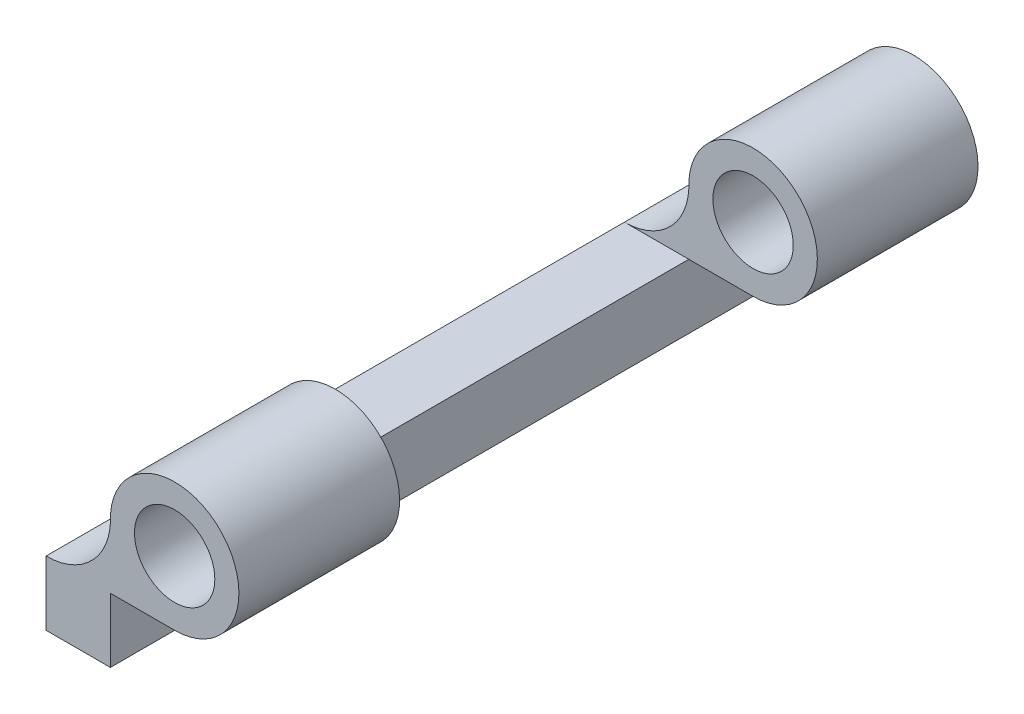
ISO-10303-21;
HEADER;
FILE_DESCRIPTION(('STEP AP214'),'2;1');
FILE_NAME('part.step','',(''),(''),'','','');
FILE_SCHEMA(('AUTOMOTIVE_DESIGN { 1 0 10303 214 1 1 1 1 }'));
ENDSEC;
DATA;
#1=APPLICATION_CONTEXT('core data for automotive mechanical design processes');
#2=APPLICATION_PROTOCOL_DEFINITION('international standard','automotive_design',2000,#1);
#3=PRODUCT_CONTEXT('',#1,'mechanical');
#4=PRODUCT('Part','Part','',(#3));
#5=PRODUCT_RELATED_PRODUCT_CATEGORY('part','',(#4));
#6=PRODUCT_DEFINITION_FORMATION('','',#4);
#7=PRODUCT_DEFINITION_CONTEXT('part definition',#1,'design');
#8=PRODUCT_DEFINITION('design','',#6,#7);
#9=PRODUCT_DEFINITION_SHAPE('','',#8);
#10=(LENGTH_UNIT() NAMED_UNIT(*) SI_UNIT(.MILLI.,.METRE.));
#11=(NAMED_UNIT(*) PLANE_ANGLE_UNIT() SI_UNIT($,.RADIAN.));
#12=(NAMED_UNIT(*) SI_UNIT($,.STERADIAN.) SOLID_ANGLE_UNIT());
#13=UNCERTAINTY_MEASURE_WITH_UNIT(LENGTH_MEASURE(1.E-05),#10,'distance_accuracy_value','');
#14=(GEOMETRIC_REPRESENTATION_CONTEXT(3) GLOBAL_UNCERTAINTY_ASSIGNED_CONTEXT((#13)) GLOBAL_UNIT_ASSIGNED_CONTEXT((#10,
#11,#12)) REPRESENTATION_CONTEXT('',''));
#15=CARTESIAN_POINT('',(0.,0.,0.));
#16=DIRECTION('',(0.,0.,1.));
#17=DIRECTION('',(1.,0.,0.));
#18=AXIS2_PLACEMENT_3D('',#15,#16,#17);
#19=CARTESIAN_POINT('',(3.33301378208247,-2.,6.4428661419352));
#20=DIRECTION('',(0.,0.,1.));
#21=DIRECTION('',(1.,0.,0.));
#22=AXIS2_PLACEMENT_3D('',#19,#20,#21);
#23=PLANE('',#22);
#24=CARTESIAN_POINT('',(7.33677889014635,4.,6.4428661419352));
#25=DIRECTION('',(0.,0.,1.));
#26=DIRECTION('',(1.,0.,0.));
#27=AXIS2_PLACEMENT_3D('',#24,#25,#26);
#28=CIRCLE('',#27,1.25);
#29=CARTESIAN_POINT('',(8.58677889014635,4.,6.4428661419352));
#30=VERTEX_POINT('',#29);
#31=EDGE_CURVE('E267',#30,#30,#28,.T.);
#32=ORIENTED_EDGE('',*,*,#31,.T.);
#33=EDGE_LOOP('',(#32));
#34=FACE_BOUND('',#33,.T.);
#35=DIRECTION('',(1.,0.,0.));
#36=VECTOR('',#35,1.);
#37=CARTESIAN_POINT('',(3.33301378208247,2.,6.4428661419352));
#38=LINE('',#37,#36);
#39=CARTESIAN_POINT('',(3.33489114739808,2.,6.4428661419352));
#40=VERTEX_POINT('',#39);
#41=CARTESIAN_POINT('',(5.33755556210372,2.,6.4428661419352));
#42=VERTEX_POINT('',#41);
#43=EDGE_CURVE('E207',#40,#42,#38,.T.);
#44=ORIENTED_EDGE('',*,*,#43,.F.);
#45=CARTESIAN_POINT('',(3.33676851271369,4.0037242538775,6.44286614193519));
#46=DIRECTION('',(0.,0.,1.));
#47=DIRECTION('',(1.,0.,0.));
#48=AXIS2_PLACEMENT_3D('',#45,#46,#47);
#49=CIRCLE('',#48,2.00372777182407);
#50=CARTESIAN_POINT('',(5.3385590370091,3.91563520563563,6.4428661419352));
#51=VERTEX_POINT('',#50);
#52=EDGE_CURVE('E260',#40,#51,#49,.T.);
#53=ORIENTED_EDGE('',*,*,#52,.T.);
#54=CARTESIAN_POINT('',(7.33677889014635,4.,6.4428661419352));
#55=DIRECTION('',(0.,0.,1.));
#56=DIRECTION('',(1.,0.,0.));
#57=AXIS2_PLACEMENT_3D('',#54,#55,#56);
#58=CIRCLE('',#57,2.);
#59=CARTESIAN_POINT('',(7.33677889014635,2.,6.4428661419352));
#60=VERTEX_POINT('',#59);
#61=EDGE_CURVE('E263',#60,#51,#58,.T.);
#62=ORIENTED_EDGE('',*,*,#61,.F.);
#63=DIRECTION('',(-1.,0.,0.));
#64=VECTOR('',#63,1.);
#65=CARTESIAN_POINT('',(3.33301378208247,2.,6.4428661419352));
#66=LINE('',#65,#64);
#67=EDGE_CURVE('E225',#60,#42,#66,.T.);
#68=ORIENTED_EDGE('',*,*,#67,.T.);
#69=EDGE_LOOP('',(#44,#53,#62,#68));
#70=FACE_BOUND('',#69,.T.);
#71=ADVANCED_FACE('F43',(#34,#70),#23,.F.);
#72=CARTESIAN_POINT('',(7.33716722612504,0.000388335978676775,3.61526276220608));
#73=DIRECTION('',(0.,0.,1.));
#74=DIRECTION('',(1.,0.,0.));
#75=AXIS2_PLACEMENT_3D('',#72,#73,#74);
#76=CYLINDRICAL_SURFACE('',#75,1.99961170172985);
#77=CARTESIAN_POINT('',(7.33716722612504,0.000388335978676775,6.4428661419352));
#78=DIRECTION('',(0.,0.,1.));
#79=DIRECTION('',(1.,0.,0.));
#80=AXIS2_PLACEMENT_3D('',#77,#78,#79);
#81=CIRCLE('',#80,1.99961170172985);
#82=CARTESIAN_POINT('',(5.33755554324946,0.000388335978676775,6.4428661419352));
#83=VERTEX_POINT('',#82);
#84=CARTESIAN_POINT('',(5.33755556210372,0.,6.4428661419352));
#85=VERTEX_POINT('',#84);
#86=EDGE_CURVE('E245',#83,#85,#81,.T.);
#87=ORIENTED_EDGE('',*,*,#86,.F.);
#88=DIRECTION('',(0.,0.,1.));
#89=VECTOR('',#88,1.);
#90=CARTESIAN_POINT('',(5.33755554324946,0.000388335978676775,3.61526276220608));
#91=LINE('',#90,#89);
#92=CARTESIAN_POINT('',(5.33755556210372,0.000388335978675908,11.4428661419352));
#93=VERTEX_POINT('',#92);
#94=EDGE_CURVE('E222',#83,#93,#91,.T.);
#95=ORIENTED_EDGE('',*,*,#94,.T.);
#96=CARTESIAN_POINT('',(7.33716722612504,0.000388335978676775,11.4428661419352));
#97=DIRECTION('',(0.,0.,-1.));
#98=DIRECTION('',(-1.,0.,0.));
#99=AXIS2_PLACEMENT_3D('',#96,#97,#98);
#100=CIRCLE('',#99,1.99961170172985);
#101=CARTESIAN_POINT('',(5.33755556210372,0.,11.4428661419352));
#102=VERTEX_POINT('',#101);
#103=EDGE_CURVE('E244',#102,#93,#100,.T.);
#104=ORIENTED_EDGE('',*,*,#103,.F.);
#105=DIRECTION('',(0.,0.,1.));
#106=VECTOR('',#105,1.);
#107=CARTESIAN_POINT('',(5.33755556210372,0.,-11.5573838580648));
#108=LINE('',#107,#106);
#109=EDGE_CURVE('E235',#102,#85,#108,.F.);
#110=ORIENTED_EDGE('',*,*,#109,.T.);
#111=EDGE_LOOP('',(#87,#95,#104,#110));
#112=FACE_BOUND('',#111,.T.);
#113=ADVANCED_FACE('F351',(#112),#76,.F.);
#114=CARTESIAN_POINT('',(3.33301378208247,-2.,11.4428661419352));
#115=DIRECTION('',(1.,0.,0.));
#116=DIRECTION('',(0.,0.,-1.));
#117=AXIS2_PLACEMENT_3D('',#114,#115,#116);
#118=PLANE('',#117);
#119=DIRECTION('',(0.,1.,0.));
#120=VECTOR('',#119,1.);
#121=CARTESIAN_POINT('',(3.33301378208247,-2.,6.4428661419352));
#122=LINE('',#121,#120);
#123=CARTESIAN_POINT('',(3.33301378208247,0.,6.4428661419352));
#124=VERTEX_POINT('',#123);
#125=CARTESIAN_POINT('',(3.33301378208247,0.000388335978675908,6.4428661419352));
#126=VERTEX_POINT('',#125);
#127=EDGE_CURVE('E11',#124,#126,#122,.T.);
#128=ORIENTED_EDGE('',*,*,#127,.F.);
#129=DIRECTION('',(0.,0.,1.));
#130=VECTOR('',#129,1.);
#131=CARTESIAN_POINT('',(3.33301378208247,0.,11.4428661419352));
#132=LINE('',#131,#130);
#133=CARTESIAN_POINT('',(3.33301378208247,0.,11.4428661419352));
#134=VERTEX_POINT('',#133);
#135=EDGE_CURVE('E232',#124,#134,#132,.T.);
#136=ORIENTED_EDGE('',*,*,#135,.T.);
#137=DIRECTION('',(0.,1.,0.));
#138=VECTOR('',#137,1.);
#139=CARTESIAN_POINT('',(3.33301378208247,-2.,11.4428661419352));
#140=LINE('',#139,#138);
#141=CARTESIAN_POINT('',(3.33301378208247,2.,11.4428661419352));
#142=VERTEX_POINT('',#141);
#143=EDGE_CURVE('E53',#134,#142,#140,.T.);
#144=ORIENTED_EDGE('',*,*,#143,.T.);
#145=DIRECTION('',(0.,0.,1.));
#146=VECTOR('',#145,1.);
#147=CARTESIAN_POINT('',(3.33301378208247,2.,-16.0273685975335));
#148=LINE('',#147,#146);
#149=EDGE_CURVE('E254',#40,#142,#148,.T.);
#150=ORIENTED_EDGE('',*,*,#149,.F.);
#151=DIRECTION('',(0.,0.,-1.));
#152=VECTOR('',#151,1.);
#153=CARTESIAN_POINT('',(3.33301378208247,2.,9.27423234127093));
#154=LINE('',#153,#152);
#155=CARTESIAN_POINT('',(3.33489114739808,2.,-6.5571338580648));
#156=VERTEX_POINT('',#155);
#157=EDGE_CURVE('E274',#40,#156,#154,.T.);
#158=ORIENTED_EDGE('',*,*,#157,.T.);
#159=DIRECTION('',(0.,0.,1.));
#160=VECTOR('',#159,1.);
#161=CARTESIAN_POINT('',(3.33301378208247,2.,-16.0273685975335));
#162=LINE('',#161,#160);
#163=CARTESIAN_POINT('',(3.33301378208247,2.,-11.5571338580648));
#164=VERTEX_POINT('',#163);
#165=EDGE_CURVE('E304',#164,#156,#162,.T.);
#166=ORIENTED_EDGE('',*,*,#165,.F.);
#167=DIRECTION('',(0.,1.,0.));
#168=VECTOR('',#167,1.);
#169=CARTESIAN_POINT('',(3.33301378208247,4.,-11.5571338580648));
#170=LINE('',#169,#168);
#171=CARTESIAN_POINT('',(3.33301378208247,0.,-11.5571338580648));
#172=VERTEX_POINT('',#171);
#173=EDGE_CURVE('E185',#172,#164,#170,.T.);
#174=ORIENTED_EDGE('',*,*,#173,.F.);
#175=DIRECTION('',(0.,0.,1.));
#176=VECTOR('',#175,1.);
#177=CARTESIAN_POINT('',(3.33301378208247,0.,11.4428661419352));
#178=LINE('',#177,#176);
#179=CARTESIAN_POINT('',(3.33301378208247,0.,-6.5571338580648));
#180=VERTEX_POINT('',#179);
#181=EDGE_CURVE('E180',#172,#180,#178,.T.);
#182=ORIENTED_EDGE('',*,*,#181,.T.);
#183=DIRECTION('',(0.,-1.,0.));
#184=VECTOR('',#183,1.);
#185=CARTESIAN_POINT('',(3.33301378208247,0.,-6.5571338580648));
#186=LINE('',#185,#184);
#187=CARTESIAN_POINT('',(3.33301378208247,0.000388335978675908,-6.5571338580648));
#188=VERTEX_POINT('',#187);
#189=EDGE_CURVE('E187',#188,#180,#186,.T.);
#190=ORIENTED_EDGE('',*,*,#189,.F.);
#191=DIRECTION('',(0.,0.,-1.));
#192=VECTOR('',#191,1.);
#193=CARTESIAN_POINT('',(3.33301378208247,0.000388335978675908,9.27423234127093));
#194=LINE('',#193,#192);
#195=EDGE_CURVE('E201',#126,#188,#194,.T.);
#196=ORIENTED_EDGE('',*,*,#195,.F.);
#197=EDGE_LOOP('',(#128,#136,#144,#150,#158,#166,#174,#182,#190,#196));
#198=FACE_BOUND('',#197,.T.);
#199=ADVANCED_FACE('F45',(#198),#118,.F.);
#200=ORIENTED_EDGE('',*,*,#127,.T.);
#201=DIRECTION('',(1.,0.,0.));
#202=VECTOR('',#201,1.);
#203=CARTESIAN_POINT('',(3.33301378208247,0.000388335978675908,6.4428661419352));
#204=LINE('',#203,#202);
#205=EDGE_CURVE('E204',#126,#83,#204,.T.);
#206=ORIENTED_EDGE('',*,*,#205,.T.);
#207=ORIENTED_EDGE('',*,*,#86,.T.);
#208=DIRECTION('',(-1.,0.,0.));
#209=VECTOR('',#208,1.);
#210=CARTESIAN_POINT('',(3.33301378208247,0.,6.4428661419352));
#211=LINE('',#210,#209);
#212=EDGE_CURVE('E230',#85,#124,#211,.T.);
#213=ORIENTED_EDGE('',*,*,#212,.T.);
#214=EDGE_LOOP('',(#200,#206,#207,#213));
#215=FACE_BOUND('',#214,.T.);
#216=ADVANCED_FACE('F353',(#215),#23,.F.);
#217=CARTESIAN_POINT('',(3.33301378208247,-2.,11.4428661419352));
#218=DIRECTION('',(0.,0.,-1.));
#219=DIRECTION('',(-1.,0.,0.));
#220=AXIS2_PLACEMENT_3D('',#217,#218,#219);
#221=PLANE('',#220);
#222=DIRECTION('',(0.,1.,0.));
#223=VECTOR('',#222,1.);
#224=CARTESIAN_POINT('',(5.33755556210372,-23.3451019965122,11.4428661419352));
#225=LINE('',#224,#223);
#226=CARTESIAN_POINT('',(5.33755556210372,2.,11.4428661419352));
#227=VERTEX_POINT('',#226);
#228=EDGE_CURVE('E219',#93,#227,#225,.T.);
#229=ORIENTED_EDGE('',*,*,#228,.T.);
#230=DIRECTION('',(-1.,0.,0.));
#231=VECTOR('',#230,1.);
#232=CARTESIAN_POINT('',(5.33755556210372,2.,11.4428661419352));
#233=LINE('',#232,#231);
#234=CARTESIAN_POINT('',(7.33677889014635,2.,11.4428661419352));
#235=VERTEX_POINT('',#234);
#236=EDGE_CURVE('E217',#235,#227,#233,.T.);
#237=ORIENTED_EDGE('',*,*,#236,.F.);
#238=CARTESIAN_POINT('',(7.33677889014635,4.,11.4428661419352));
#239=DIRECTION('',(0.,0.,1.));
#240=DIRECTION('',(1.,0.,0.));
#241=AXIS2_PLACEMENT_3D('',#238,#239,#240);
#242=CIRCLE('',#241,2.);
#243=CARTESIAN_POINT('',(5.3385590370091,3.91563520563562,11.4428661419352));
#244=VERTEX_POINT('',#243);
#245=EDGE_CURVE('E238',#235,#244,#242,.T.);
#246=ORIENTED_EDGE('',*,*,#245,.T.);
#247=CARTESIAN_POINT('',(3.33676851271369,4.0037242538775,11.4428661419352));
#248=DIRECTION('',(0.,0.,1.));
#249=DIRECTION('',(1.,0.,0.));
#250=AXIS2_PLACEMENT_3D('',#247,#248,#249);
#251=CIRCLE('',#250,2.00372777182407);
#252=EDGE_CURVE('E247',#244,#142,#251,.F.);
#253=ORIENTED_EDGE('',*,*,#252,.T.);
#254=ORIENTED_EDGE('',*,*,#143,.F.);
#255=DIRECTION('',(1.,0.,0.));
#256=VECTOR('',#255,1.);
#257=CARTESIAN_POINT('',(1.33465315354599,0.,11.4428661419352));
#258=LINE('',#257,#256);
#259=EDGE_CURVE('E227',#134,#102,#258,.T.);
#260=ORIENTED_EDGE('',*,*,#259,.T.);
#261=ORIENTED_EDGE('',*,*,#103,.T.);
#262=EDGE_LOOP('',(#229,#237,#246,#253,#254,#260,#261));
#263=FACE_BOUND('',#262,.T.);
#264=CARTESIAN_POINT('',(7.33677889014635,4.,11.4428661419352));
#265=DIRECTION('',(0.,0.,1.));
#266=DIRECTION('',(1.,0.,0.));
#267=AXIS2_PLACEMENT_3D('',#264,#265,#266);
#268=CIRCLE('',#267,1.25);
#269=CARTESIAN_POINT('',(8.58677889014635,4.,11.4428661419352));
#270=VERTEX_POINT('',#269);
#271=EDGE_CURVE('E241',#270,#270,#268,.T.);
#272=ORIENTED_EDGE('',*,*,#271,.F.);
#273=EDGE_LOOP('',(#272));
#274=FACE_BOUND('',#273,.T.);
#275=ADVANCED_FACE('F364',(#263,#274),#221,.F.);
#276=CARTESIAN_POINT('',(3.33676851271369,4.0037242538775,-16.0273685975335));
#277=DIRECTION('',(0.,0.,1.));
#278=DIRECTION('',(1.,0.,0.));
#279=AXIS2_PLACEMENT_3D('',#276,#277,#278);
#280=CYLINDRICAL_SURFACE('',#279,2.00372777182407);
#281=ORIENTED_EDGE('',*,*,#149,.T.);
#282=ORIENTED_EDGE('',*,*,#252,.F.);
#283=DIRECTION('',(0.,0.,1.));
#284=VECTOR('',#283,1.);
#285=CARTESIAN_POINT('',(5.3385590370091,3.91563520563563,-16.0273685975336));
#286=LINE('',#285,#284);
#287=EDGE_CURVE('E259',#51,#244,#286,.T.);
#288=ORIENTED_EDGE('',*,*,#287,.F.);
#289=ORIENTED_EDGE('',*,*,#52,.F.);
#290=EDGE_LOOP('',(#281,#282,#288,#289));
#291=FACE_BOUND('',#290,.T.);
#292=ADVANCED_FACE('F370',(#291),#280,.F.);
#293=CARTESIAN_POINT('',(7.33677889014635,4.,-40.2139881075572));
#294=DIRECTION('',(0.,0.,1.));
#295=DIRECTION('',(1.,0.,0.));
#296=AXIS2_PLACEMENT_3D('',#293,#294,#295);
#297=CYLINDRICAL_SURFACE('',#296,1.25);
#298=ORIENTED_EDGE('',*,*,#31,.F.);
#299=EDGE_LOOP('',(#298));
#300=FACE_BOUND('',#299,.T.);
#301=ORIENTED_EDGE('',*,*,#271,.T.);
#302=EDGE_LOOP('',(#301));
#303=FACE_BOUND('',#302,.T.);
#304=ADVANCED_FACE('F558',(#300,#303),#297,.F.);
#305=CARTESIAN_POINT('',(7.33677889014635,4.,-40.2139881075572));
#306=DIRECTION('',(0.,0.,1.));
#307=DIRECTION('',(1.,0.,0.));
#308=AXIS2_PLACEMENT_3D('',#305,#306,#307);
#309=CYLINDRICAL_SURFACE('',#308,2.);
#310=DIRECTION('',(0.,0.,1.));
#311=VECTOR('',#310,1.);
#312=CARTESIAN_POINT('',(7.33677889014635,2.,-16.0273685975336));
#313=LINE('',#312,#311);
#314=EDGE_CURVE('E258',#60,#235,#313,.T.);
#315=ORIENTED_EDGE('',*,*,#314,.F.);
#316=ORIENTED_EDGE('',*,*,#61,.T.);
#317=ORIENTED_EDGE('',*,*,#287,.T.);
#318=ORIENTED_EDGE('',*,*,#245,.F.);
#319=EDGE_LOOP('',(#315,#316,#317,#318));
#320=FACE_BOUND('',#319,.T.);
#321=ADVANCED_FACE('F372',(#320),#309,.T.);
#322=CARTESIAN_POINT('',(1.33465315354599,0.,11.4428661419352));
#323=DIRECTION('',(0.,1.,0.));
#324=DIRECTION('',(0.,0.,1.));
#325=AXIS2_PLACEMENT_3D('',#322,#323,#324);
#326=PLANE('',#325);
#327=ORIENTED_EDGE('',*,*,#212,.F.);
#328=ORIENTED_EDGE('',*,*,#109,.F.);
#329=ORIENTED_EDGE('',*,*,#259,.F.);
#330=ORIENTED_EDGE('',*,*,#135,.F.);
#331=EDGE_LOOP('',(#327,#328,#329,#330));
#332=FACE_BOUND('',#331,.T.);
#333=ADVANCED_FACE('F389',(#332),#326,.F.);
#334=CARTESIAN_POINT('',(0.,2.,0.));
#335=DIRECTION('',(0.,1.,0.));
#336=DIRECTION('',(0.,0.,1.));
#337=AXIS2_PLACEMENT_3D('',#334,#335,#336);
#338=PLANE('',#337);
#339=ORIENTED_EDGE('',*,*,#314,.T.);
#340=ORIENTED_EDGE('',*,*,#236,.T.);
#341=DIRECTION('',(0.,0.,-1.));
#342=VECTOR('',#341,1.);
#343=CARTESIAN_POINT('',(5.33755556210372,2.,-11.5571338580648));
#344=LINE('',#343,#342);
#345=EDGE_CURVE('E214',#227,#42,#344,.T.);
#346=ORIENTED_EDGE('',*,*,#345,.T.);
#347=ORIENTED_EDGE('',*,*,#67,.F.);
#348=EDGE_LOOP('',(#339,#340,#346,#347));
#349=FACE_BOUND('',#348,.T.);
#350=ADVANCED_FACE('F385',(#349),#338,.F.);
#351=CARTESIAN_POINT('',(5.33755556210372,-23.3451019965122,-11.5571338580648));
#352=DIRECTION('',(1.,0.,0.));
#353=DIRECTION('',(0.,0.,-1.));
#354=AXIS2_PLACEMENT_3D('',#351,#352,#353);
#355=PLANE('',#354);
#356=ORIENTED_EDGE('',*,*,#94,.F.);
#357=DIRECTION('',(0.,0.,-1.));
#358=VECTOR('',#357,1.);
#359=CARTESIAN_POINT('',(5.33755556210372,0.000388335978675908,9.27423234127093));
#360=LINE('',#359,#358);
#361=CARTESIAN_POINT('',(5.33755556210372,0.000388335978675908,-6.5571338580648));
#362=VERTEX_POINT('',#361);
#363=EDGE_CURVE('E200',#83,#362,#360,.T.);
#364=ORIENTED_EDGE('',*,*,#363,.T.);
#365=DIRECTION('',(0.,0.,1.));
#366=VECTOR('',#365,1.);
#367=CARTESIAN_POINT('',(5.33755554324946,0.000388335978682196,-11.5573838580648));
#368=LINE('',#367,#366);
#369=CARTESIAN_POINT('',(5.33755556210372,0.000388335978682847,-11.5571338580648));
#370=VERTEX_POINT('',#369);
#371=EDGE_CURVE('E162',#362,#370,#368,.F.);
#372=ORIENTED_EDGE('',*,*,#371,.T.);
#373=DIRECTION('',(0.,1.,0.));
#374=VECTOR('',#373,1.);
#375=CARTESIAN_POINT('',(5.33755556210372,-23.3451019965122,-11.5571338580648));
#376=LINE('',#375,#374);
#377=CARTESIAN_POINT('',(5.33755556210372,2.,-11.5571338580648));
#378=VERTEX_POINT('',#377);
#379=EDGE_CURVE('E158',#370,#378,#376,.T.);
#380=ORIENTED_EDGE('',*,*,#379,.T.);
#381=DIRECTION('',(0.,0.,-1.));
#382=VECTOR('',#381,1.);
#383=CARTESIAN_POINT('',(5.33755556210372,2.,-11.5571338580648));
#384=LINE('',#383,#382);
#385=CARTESIAN_POINT('',(5.33755556210372,2.,-6.5571338580648));
#386=VERTEX_POINT('',#385);
#387=EDGE_CURVE('E146',#386,#378,#384,.T.);
#388=ORIENTED_EDGE('',*,*,#387,.F.);
#389=DIRECTION('',(0.,0.,-1.));
#390=VECTOR('',#389,1.);
#391=CARTESIAN_POINT('',(5.33755556210372,2.,9.27423234127093));
#392=LINE('',#391,#390);
#393=EDGE_CURVE('E211',#42,#386,#392,.T.);
#394=ORIENTED_EDGE('',*,*,#393,.F.);
#395=ORIENTED_EDGE('',*,*,#345,.F.);
#396=ORIENTED_EDGE('',*,*,#228,.F.);
#397=EDGE_LOOP('',(#356,#364,#372,#380,#388,#394,#395,#396));
#398=FACE_BOUND('',#397,.T.);
#399=ADVANCED_FACE('F160',(#398),#355,.T.);
#400=CARTESIAN_POINT('',(3.33301378208247,0.000388335978675908,9.27423234127093));
#401=DIRECTION('',(0.,1.,0.));
#402=DIRECTION('',(0.,0.,1.));
#403=AXIS2_PLACEMENT_3D('',#400,#401,#402);
#404=PLANE('',#403);
#405=ORIENTED_EDGE('',*,*,#205,.F.);
#406=ORIENTED_EDGE('',*,*,#195,.T.);
#407=DIRECTION('',(1.,0.,0.));
#408=VECTOR('',#407,1.);
#409=CARTESIAN_POINT('',(3.33301378208247,0.000388335978675908,-6.5571338580648));
#410=LINE('',#409,#408);
#411=EDGE_CURVE('E197',#188,#362,#410,.T.);
#412=ORIENTED_EDGE('',*,*,#411,.T.);
#413=ORIENTED_EDGE('',*,*,#363,.F.);
#414=EDGE_LOOP('',(#405,#406,#412,#413));
#415=FACE_BOUND('',#414,.T.);
#416=ADVANCED_FACE('F291',(#415),#404,.F.);
#417=CARTESIAN_POINT('',(3.33301378208247,2.,9.27423234127093));
#418=DIRECTION('',(0.,1.,0.));
#419=DIRECTION('',(0.,0.,1.));
#420=AXIS2_PLACEMENT_3D('',#417,#418,#419);
#421=PLANE('',#420);
#422=ORIENTED_EDGE('',*,*,#157,.F.);
#423=ORIENTED_EDGE('',*,*,#43,.T.);
#424=ORIENTED_EDGE('',*,*,#393,.T.);
#425=DIRECTION('',(1.,0.,0.));
#426=VECTOR('',#425,1.);
#427=CARTESIAN_POINT('',(3.33301378208247,2.,-6.5571338580648));
#428=LINE('',#427,#426);
#429=EDGE_CURVE('E272',#156,#386,#428,.T.);
#430=ORIENTED_EDGE('',*,*,#429,.F.);
#431=EDGE_LOOP('',(#422,#423,#424,#430));
#432=FACE_BOUND('',#431,.T.);
#433=ADVANCED_FACE('F407',(#432),#421,.T.);
#434=CARTESIAN_POINT('',(0.,0.,-6.5571338580648));
#435=DIRECTION('',(0.,0.,-1.));
#436=DIRECTION('',(-1.,0.,0.));
#437=AXIS2_PLACEMENT_3D('',#434,#435,#436);
#438=PLANE('',#437);
#439=ORIENTED_EDGE('',*,*,#411,.F.);
#440=ORIENTED_EDGE('',*,*,#189,.T.);
#441=DIRECTION('',(1.,0.,0.));
#442=VECTOR('',#441,1.);
#443=CARTESIAN_POINT('',(0.,0.,-6.5571338580648));
#444=LINE('',#443,#442);
#445=CARTESIAN_POINT('',(5.33755556210372,0.,-6.5571338580648));
#446=VERTEX_POINT('',#445);
#447=EDGE_CURVE('E177',#180,#446,#444,.T.);
#448=ORIENTED_EDGE('',*,*,#447,.T.);
#449=CARTESIAN_POINT('',(7.33716722612504,0.000388335978682196,-6.5571338580648));
#450=DIRECTION('',(0.,0.,-1.));
#451=DIRECTION('',(-1.,0.,0.));
#452=AXIS2_PLACEMENT_3D('',#449,#450,#451);
#453=CIRCLE('',#452,1.99961170172985);
#454=EDGE_CURVE('E190',#446,#362,#453,.T.);
#455=ORIENTED_EDGE('',*,*,#454,.T.);
#456=EDGE_LOOP('',(#439,#440,#448,#455));
#457=FACE_BOUND('',#456,.T.);
#458=ADVANCED_FACE('F300',(#457),#438,.F.);
#459=CARTESIAN_POINT('',(7.33716722612504,0.000388335978682196,-11.5573838580648));
#460=DIRECTION('',(0.,0.,1.));
#461=DIRECTION('',(1.,0.,0.));
#462=AXIS2_PLACEMENT_3D('',#459,#460,#461);
#463=CYLINDRICAL_SURFACE('',#462,1.99961170172985);
#464=ORIENTED_EDGE('',*,*,#371,.F.);
#465=ORIENTED_EDGE('',*,*,#454,.F.);
#466=DIRECTION('',(0.,0.,1.));
#467=VECTOR('',#466,1.);
#468=CARTESIAN_POINT('',(5.33755556210372,0.,-11.5571338580648));
#469=LINE('',#468,#467);
#470=CARTESIAN_POINT('',(5.33755556210372,0.,-11.5571338580648));
#471=VERTEX_POINT('',#470);
#472=EDGE_CURVE('E183',#471,#446,#469,.T.);
#473=ORIENTED_EDGE('',*,*,#472,.F.);
#474=CARTESIAN_POINT('',(7.33716722612504,0.000388335978682196,-11.5571338580648));
#475=DIRECTION('',(0.,0.,1.));
#476=DIRECTION('',(1.,0.,0.));
#477=AXIS2_PLACEMENT_3D('',#474,#475,#476);
#478=CIRCLE('',#477,1.99961170172985);
#479=EDGE_CURVE('E299',#370,#471,#478,.T.);
#480=ORIENTED_EDGE('',*,*,#479,.F.);
#481=EDGE_LOOP('',(#464,#465,#473,#480));
#482=FACE_BOUND('',#481,.T.);
#483=ADVANCED_FACE('F297',(#482),#463,.F.);
#484=CARTESIAN_POINT('',(7.33677889014635,4.,-40.2139881075572));
#485=DIRECTION('',(0.,0.,1.));
#486=DIRECTION('',(1.,0.,0.));
#487=AXIS2_PLACEMENT_3D('',#484,#485,#486);
#488=CYLINDRICAL_SURFACE('',#487,2.);
#489=DIRECTION('',(0.,0.,1.));
#490=VECTOR('',#489,1.);
#491=CARTESIAN_POINT('',(7.33677889014635,2.,-16.0273685975336));
#492=LINE('',#491,#490);
#493=CARTESIAN_POINT('',(7.33677889014635,2.,-11.5571338580648));
#494=VERTEX_POINT('',#493);
#495=CARTESIAN_POINT('',(7.33677889014635,2.,-6.5571338580648));
#496=VERTEX_POINT('',#495);
#497=EDGE_CURVE('E314',#494,#496,#492,.T.);
#498=ORIENTED_EDGE('',*,*,#497,.F.);
#499=CARTESIAN_POINT('',(7.33677889014635,4.,-11.5571338580648));
#500=DIRECTION('',(0.,0.,1.));
#501=DIRECTION('',(1.,0.,0.));
#502=AXIS2_PLACEMENT_3D('',#499,#500,#501);
#503=CIRCLE('',#502,2.);
#504=CARTESIAN_POINT('',(5.3385590370091,3.91563520563563,-11.5571338580648));
#505=VERTEX_POINT('',#504);
#506=EDGE_CURVE('E169',#494,#505,#503,.T.);
#507=ORIENTED_EDGE('',*,*,#506,.T.);
#508=DIRECTION('',(0.,0.,1.));
#509=VECTOR('',#508,1.);
#510=CARTESIAN_POINT('',(5.3385590370091,3.91563520563563,-16.0273685975336));
#511=LINE('',#510,#509);
#512=CARTESIAN_POINT('',(5.3385590370091,3.91563520563563,-6.55713385806481));
#513=VERTEX_POINT('',#512);
#514=EDGE_CURVE('E309',#505,#513,#511,.T.);
#515=ORIENTED_EDGE('',*,*,#514,.T.);
#516=CARTESIAN_POINT('',(7.33677889014635,4.,-6.55713385806481));
#517=DIRECTION('',(0.,0.,-1.));
#518=DIRECTION('',(-1.,0.,0.));
#519=AXIS2_PLACEMENT_3D('',#516,#517,#518);
#520=CIRCLE('',#519,2.);
#521=EDGE_CURVE('E195',#513,#496,#520,.T.);
#522=ORIENTED_EDGE('',*,*,#521,.T.);
#523=EDGE_LOOP('',(#498,#507,#515,#522));
#524=FACE_BOUND('',#523,.T.);
#525=ADVANCED_FACE('F329',(#524),#488,.T.);
#526=CARTESIAN_POINT('',(7.33677889014635,4.,-6.55713385806481));
#527=DIRECTION('',(0.,0.,-1.));
#528=DIRECTION('',(-1.,0.,0.));
#529=AXIS2_PLACEMENT_3D('',#526,#527,#528);
#530=CIRCLE('',#529,1.25);
#531=CARTESIAN_POINT('',(6.08677889014635,4.,-6.55713385806481));
#532=VERTEX_POINT('',#531);
#533=EDGE_CURVE('E285',#532,#532,#530,.T.);
#534=ORIENTED_EDGE('',*,*,#533,.T.);
#535=EDGE_LOOP('',(#534));
#536=FACE_BOUND('',#535,.T.);
#537=CARTESIAN_POINT('',(3.33676851271369,4.0037242538775,-6.5571338580648));
#538=DIRECTION('',(0.,0.,-1.));
#539=DIRECTION('',(-1.,0.,0.));
#540=AXIS2_PLACEMENT_3D('',#537,#538,#539);
#541=CIRCLE('',#540,2.00372777182407);
#542=EDGE_CURVE('E315',#513,#156,#541,.T.);
#543=ORIENTED_EDGE('',*,*,#542,.T.);
#544=ORIENTED_EDGE('',*,*,#429,.T.);
#545=DIRECTION('',(1.,0.,0.));
#546=VECTOR('',#545,1.);
#547=CARTESIAN_POINT('',(0.,2.,-6.5571338580648));
#548=LINE('',#547,#546);
#549=EDGE_CURVE('E153',#386,#496,#548,.T.);
#550=ORIENTED_EDGE('',*,*,#549,.T.);
#551=ORIENTED_EDGE('',*,*,#521,.F.);
#552=EDGE_LOOP('',(#543,#544,#550,#551));
#553=FACE_BOUND('',#552,.T.);
#554=ADVANCED_FACE('F331',(#536,#553),#438,.F.);
#555=CARTESIAN_POINT('',(7.33677889014635,4.,-11.5571338580648));
#556=DIRECTION('',(0.,0.,1.));
#557=DIRECTION('',(1.,0.,0.));
#558=AXIS2_PLACEMENT_3D('',#555,#556,#557);
#559=PLANE('',#558);
#560=CARTESIAN_POINT('',(7.33677889014635,4.,-11.5571338580648));
#561=DIRECTION('',(0.,0.,1.));
#562=DIRECTION('',(1.,0.,0.));
#563=AXIS2_PLACEMENT_3D('',#560,#561,#562);
#564=CIRCLE('',#563,1.25);
#565=CARTESIAN_POINT('',(8.58677889014635,4.,-11.5571338580648));
#566=VERTEX_POINT('',#565);
#567=EDGE_CURVE('E317',#566,#566,#564,.T.);
#568=ORIENTED_EDGE('',*,*,#567,.T.);
#569=EDGE_LOOP('',(#568));
#570=FACE_BOUND('',#569,.T.);
#571=ORIENTED_EDGE('',*,*,#506,.F.);
#572=DIRECTION('',(1.,0.,0.));
#573=VECTOR('',#572,1.);
#574=CARTESIAN_POINT('',(5.33755556210372,2.,-11.5571338580648));
#575=LINE('',#574,#573);
#576=EDGE_CURVE('E150',#378,#494,#575,.T.);
#577=ORIENTED_EDGE('',*,*,#576,.F.);
#578=ORIENTED_EDGE('',*,*,#379,.F.);
#579=ORIENTED_EDGE('',*,*,#479,.T.);
#580=DIRECTION('',(1.,0.,0.));
#581=VECTOR('',#580,1.);
#582=CARTESIAN_POINT('',(1.33465315354599,0.,-11.5571338580648));
#583=LINE('',#582,#581);
#584=EDGE_CURVE('E174',#172,#471,#583,.T.);
#585=ORIENTED_EDGE('',*,*,#584,.F.);
#586=ORIENTED_EDGE('',*,*,#173,.T.);
#587=CARTESIAN_POINT('',(3.33676851271369,4.0037242538775,-11.5571338580648));
#588=DIRECTION('',(0.,0.,1.));
#589=DIRECTION('',(1.,0.,0.));
#590=AXIS2_PLACEMENT_3D('',#587,#588,#589);
#591=CIRCLE('',#590,2.00372777182407);
#592=EDGE_CURVE('E302',#164,#505,#591,.T.);
#593=ORIENTED_EDGE('',*,*,#592,.T.);
#594=EDGE_LOOP('',(#571,#577,#578,#579,#585,#586,#593));
#595=FACE_BOUND('',#594,.T.);
#596=ADVANCED_FACE('F167',(#570,#595),#559,.F.);
#597=CARTESIAN_POINT('',(7.33677889014635,4.,-40.2139881075572));
#598=DIRECTION('',(0.,0.,1.));
#599=DIRECTION('',(1.,0.,0.));
#600=AXIS2_PLACEMENT_3D('',#597,#598,#599);
#601=CYLINDRICAL_SURFACE('',#600,1.25);
#602=ORIENTED_EDGE('',*,*,#533,.F.);
#603=EDGE_LOOP('',(#602));
#604=FACE_BOUND('',#603,.T.);
#605=ORIENTED_EDGE('',*,*,#567,.F.);
#606=EDGE_LOOP('',(#605));
#607=FACE_BOUND('',#606,.T.);
#608=ADVANCED_FACE('F347',(#604,#607),#601,.F.);
#609=CARTESIAN_POINT('',(3.33676851271369,4.0037242538775,-16.0273685975335));
#610=DIRECTION('',(0.,0.,1.));
#611=DIRECTION('',(1.,0.,0.));
#612=AXIS2_PLACEMENT_3D('',#609,#610,#611);
#613=CYLINDRICAL_SURFACE('',#612,2.00372777182407);
#614=ORIENTED_EDGE('',*,*,#165,.T.);
#615=ORIENTED_EDGE('',*,*,#542,.F.);
#616=ORIENTED_EDGE('',*,*,#514,.F.);
#617=ORIENTED_EDGE('',*,*,#592,.F.);
#618=EDGE_LOOP('',(#614,#615,#616,#617));
#619=FACE_BOUND('',#618,.T.);
#620=ADVANCED_FACE('F334',(#619),#613,.F.);
#621=CARTESIAN_POINT('',(1.33465315354599,0.,11.4428661419352));
#622=DIRECTION('',(0.,1.,0.));
#623=DIRECTION('',(0.,0.,1.));
#624=AXIS2_PLACEMENT_3D('',#621,#622,#623);
#625=PLANE('',#624);
#626=ORIENTED_EDGE('',*,*,#584,.T.);
#627=ORIENTED_EDGE('',*,*,#472,.T.);
#628=ORIENTED_EDGE('',*,*,#447,.F.);
#629=ORIENTED_EDGE('',*,*,#181,.F.);
#630=EDGE_LOOP('',(#626,#627,#628,#629));
#631=FACE_BOUND('',#630,.T.);
#632=ADVANCED_FACE('F337',(#631),#625,.F.);
#633=CARTESIAN_POINT('',(0.,2.,0.));
#634=DIRECTION('',(0.,1.,0.));
#635=DIRECTION('',(0.,0.,1.));
#636=AXIS2_PLACEMENT_3D('',#633,#634,#635);
#637=PLANE('',#636);
#638=ORIENTED_EDGE('',*,*,#387,.T.);
#639=ORIENTED_EDGE('',*,*,#576,.T.);
#640=ORIENTED_EDGE('',*,*,#497,.T.);
#641=ORIENTED_EDGE('',*,*,#549,.F.);
#642=EDGE_LOOP('',(#638,#639,#640,#641));
#643=FACE_BOUND('',#642,.T.);
#644=ADVANCED_FACE('F148',(#643),#637,.F.);
#645=CLOSED_SHELL('',(#71,#113,#199,#216,#275,#292,#304,#321,#333,#350,#399,#416,#433,#458,#483,
#525,#554,#596,#608,#620,#632,#644));
#646=MANIFOLD_SOLID_BREP('B2',#645);
#647=ADVANCED_BREP_SHAPE_REPRESENTATION('',(#18,#646),#14);
#648=SHAPE_DEFINITION_REPRESENTATION(#9,#647);
ENDSEC;
END-ISO-10303-21;
